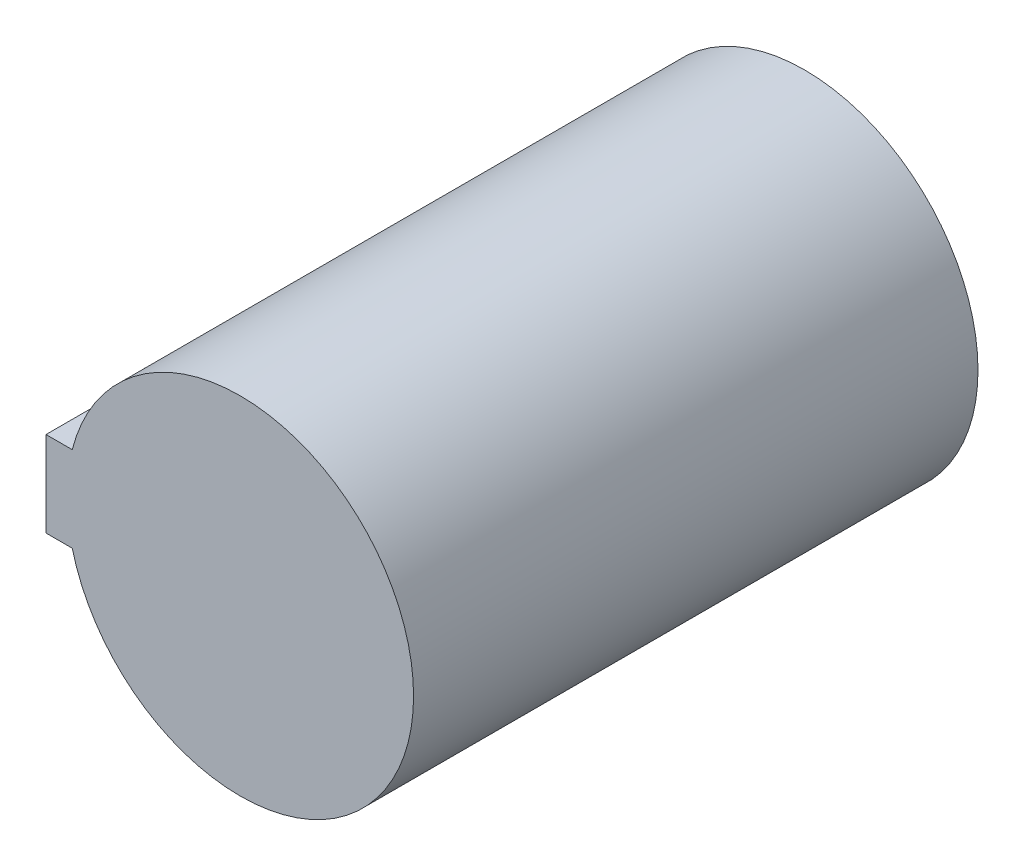
ISO-10303-21;
HEADER;
FILE_DESCRIPTION(('STEP AP214'),'2;1');
FILE_NAME('part.step','',(''),(''),'','','');
FILE_SCHEMA(('AUTOMOTIVE_DESIGN { 1 0 10303 214 1 1 1 1 }'));
ENDSEC;
DATA;
#1=APPLICATION_CONTEXT('core data for automotive mechanical design processes');
#2=APPLICATION_PROTOCOL_DEFINITION('international standard','automotive_design',2000,#1);
#3=PRODUCT_CONTEXT('',#1,'mechanical');
#4=PRODUCT('Part','Part','',(#3));
#5=PRODUCT_RELATED_PRODUCT_CATEGORY('part','',(#4));
#6=PRODUCT_DEFINITION_FORMATION('','',#4);
#7=PRODUCT_DEFINITION_CONTEXT('part definition',#1,'design');
#8=PRODUCT_DEFINITION('design','',#6,#7);
#9=PRODUCT_DEFINITION_SHAPE('','',#8);
#10=(LENGTH_UNIT() NAMED_UNIT(*) SI_UNIT(.MILLI.,.METRE.));
#11=(NAMED_UNIT(*) PLANE_ANGLE_UNIT() SI_UNIT($,.RADIAN.));
#12=(NAMED_UNIT(*) SI_UNIT($,.STERADIAN.) SOLID_ANGLE_UNIT());
#13=UNCERTAINTY_MEASURE_WITH_UNIT(LENGTH_MEASURE(1.E-05),#10,'distance_accuracy_value','');
#14=(GEOMETRIC_REPRESENTATION_CONTEXT(3) GLOBAL_UNCERTAINTY_ASSIGNED_CONTEXT((#13)) GLOBAL_UNIT_ASSIGNED_CONTEXT((#10,
#11,#12)) REPRESENTATION_CONTEXT('',''));
#15=CARTESIAN_POINT('',(0.,0.,0.));
#16=DIRECTION('',(0.,0.,1.));
#17=DIRECTION('',(1.,0.,0.));
#18=AXIS2_PLACEMENT_3D('',#15,#16,#17);
#19=CARTESIAN_POINT('',(0.,0.,25.));
#20=DIRECTION('',(0.,0.,-1.));
#21=DIRECTION('',(-1.,0.,0.));
#22=AXIS2_PLACEMENT_3D('',#19,#20,#21);
#23=CYLINDRICAL_SURFACE('',#22,19.9);
#24=DIRECTION('',(0.,0.,-1.));
#25=VECTOR('',#24,1.);
#26=CARTESIAN_POINT('',(-19.2873015219859,-4.9,25.));
#27=LINE('',#26,#25);
#28=CARTESIAN_POINT('',(-19.2873015219859,-4.9,25.));
#29=VERTEX_POINT('',#28);
#30=CARTESIAN_POINT('',(-19.2873015219859,-4.9,0.));
#31=VERTEX_POINT('',#30);
#32=EDGE_CURVE('E107',#29,#31,#27,.T.);
#33=ORIENTED_EDGE('',*,*,#32,.T.);
#34=CARTESIAN_POINT('',(0.,0.,0.));
#35=DIRECTION('',(0.,0.,-1.));
#36=DIRECTION('',(-1.,0.,0.));
#37=AXIS2_PLACEMENT_3D('',#34,#35,#36);
#38=CIRCLE('',#37,19.9);
#39=CARTESIAN_POINT('',(-19.2873015219859,4.9,0.));
#40=VERTEX_POINT('',#39);
#41=EDGE_CURVE('E11',#31,#40,#38,.T.);
#42=ORIENTED_EDGE('',*,*,#41,.T.);
#43=DIRECTION('',(0.,0.,-1.));
#44=VECTOR('',#43,1.);
#45=CARTESIAN_POINT('',(-19.2873015219859,4.9,25.));
#46=LINE('',#45,#44);
#47=CARTESIAN_POINT('',(-19.2873015219859,4.9,25.));
#48=VERTEX_POINT('',#47);
#49=EDGE_CURVE('E48',#48,#40,#46,.T.);
#50=ORIENTED_EDGE('',*,*,#49,.F.);
#51=CARTESIAN_POINT('',(0.,0.,25.));
#52=DIRECTION('',(0.,0.,1.));
#53=DIRECTION('',(1.,0.,0.));
#54=AXIS2_PLACEMENT_3D('',#51,#52,#53);
#55=CIRCLE('',#54,19.9);
#56=EDGE_CURVE('E108',#29,#48,#55,.T.);
#57=ORIENTED_EDGE('',*,*,#56,.F.);
#58=EDGE_LOOP('',(#33,#42,#50,#57));
#59=FACE_BOUND('',#58,.T.);
#60=CARTESIAN_POINT('',(0.,0.,-39.8));
#61=DIRECTION('',(0.,0.,-1.));
#62=DIRECTION('',(-1.,0.,0.));
#63=AXIS2_PLACEMENT_3D('',#60,#61,#62);
#64=CIRCLE('',#63,19.9);
#65=CARTESIAN_POINT('',(-19.9,0.,-39.8));
#66=VERTEX_POINT('',#65);
#67=EDGE_CURVE('E103',#66,#66,#64,.T.);
#68=ORIENTED_EDGE('',*,*,#67,.F.);
#69=EDGE_LOOP('',(#68));
#70=FACE_BOUND('',#69,.T.);
#71=ADVANCED_FACE('F45',(#59,#70),#23,.T.);
#72=CARTESIAN_POINT('',(-22.3,4.9,25.));
#73=DIRECTION('',(0.,-1.,0.));
#74=DIRECTION('',(1.,0.,0.));
#75=AXIS2_PLACEMENT_3D('',#72,#73,#74);
#76=PLANE('',#75);
#77=DIRECTION('',(-1.,0.,0.));
#78=VECTOR('',#77,1.);
#79=CARTESIAN_POINT('',(-22.3,4.9,0.));
#80=LINE('',#79,#78);
#81=CARTESIAN_POINT('',(-22.3,4.9,0.));
#82=VERTEX_POINT('',#81);
#83=EDGE_CURVE('E96',#40,#82,#80,.T.);
#84=ORIENTED_EDGE('',*,*,#83,.T.);
#85=DIRECTION('',(0.,0.,-1.));
#86=VECTOR('',#85,1.);
#87=CARTESIAN_POINT('',(-22.3,4.9,25.));
#88=LINE('',#87,#86);
#89=CARTESIAN_POINT('',(-22.3,4.9,25.));
#90=VERTEX_POINT('',#89);
#91=EDGE_CURVE('E100',#90,#82,#88,.T.);
#92=ORIENTED_EDGE('',*,*,#91,.F.);
#93=DIRECTION('',(-1.,0.,0.));
#94=VECTOR('',#93,1.);
#95=CARTESIAN_POINT('',(-22.3,4.9,25.));
#96=LINE('',#95,#94);
#97=EDGE_CURVE('E92',#48,#90,#96,.T.);
#98=ORIENTED_EDGE('',*,*,#97,.F.);
#99=ORIENTED_EDGE('',*,*,#49,.T.);
#100=EDGE_LOOP('',(#84,#92,#98,#99));
#101=FACE_BOUND('',#100,.T.);
#102=ADVANCED_FACE('F95',(#101),#76,.F.);
#103=CARTESIAN_POINT('',(-22.3,-4.90000000000001,25.));
#104=DIRECTION('',(1.,0.,0.));
#105=DIRECTION('',(0.,0.,-1.));
#106=AXIS2_PLACEMENT_3D('',#103,#104,#105);
#107=PLANE('',#106);
#108=DIRECTION('',(0.,-1.,0.));
#109=VECTOR('',#108,1.);
#110=CARTESIAN_POINT('',(-22.3,-4.90000000000001,0.));
#111=LINE('',#110,#109);
#112=CARTESIAN_POINT('',(-22.3,-4.90000000000001,0.));
#113=VERTEX_POINT('',#112);
#114=EDGE_CURVE('E78',#82,#113,#111,.T.);
#115=ORIENTED_EDGE('',*,*,#114,.T.);
#116=DIRECTION('',(0.,0.,-1.));
#117=VECTOR('',#116,1.);
#118=CARTESIAN_POINT('',(-22.3,-4.90000000000001,25.));
#119=LINE('',#118,#117);
#120=CARTESIAN_POINT('',(-22.3,-4.90000000000001,25.));
#121=VERTEX_POINT('',#120);
#122=EDGE_CURVE('E111',#121,#113,#119,.T.);
#123=ORIENTED_EDGE('',*,*,#122,.F.);
#124=DIRECTION('',(0.,-1.,0.));
#125=VECTOR('',#124,1.);
#126=CARTESIAN_POINT('',(-22.3,-4.90000000000001,25.));
#127=LINE('',#126,#125);
#128=EDGE_CURVE('E116',#90,#121,#127,.T.);
#129=ORIENTED_EDGE('',*,*,#128,.F.);
#130=ORIENTED_EDGE('',*,*,#91,.T.);
#131=EDGE_LOOP('',(#115,#123,#129,#130));
#132=FACE_BOUND('',#131,.T.);
#133=ADVANCED_FACE('F123',(#132),#107,.F.);
#134=CARTESIAN_POINT('',(-22.3,-4.90000000000001,25.));
#135=DIRECTION('',(0.,1.,0.));
#136=DIRECTION('',(-1.,0.,0.));
#137=AXIS2_PLACEMENT_3D('',#134,#135,#136);
#138=PLANE('',#137);
#139=DIRECTION('',(1.,0.,0.));
#140=VECTOR('',#139,1.);
#141=CARTESIAN_POINT('',(-22.3,-4.90000000000001,0.));
#142=LINE('',#141,#140);
#143=EDGE_CURVE('E119',#113,#31,#142,.T.);
#144=ORIENTED_EDGE('',*,*,#143,.T.);
#145=ORIENTED_EDGE('',*,*,#32,.F.);
#146=DIRECTION('',(1.,0.,0.));
#147=VECTOR('',#146,1.);
#148=CARTESIAN_POINT('',(-22.3,-4.90000000000001,25.));
#149=LINE('',#148,#147);
#150=EDGE_CURVE('E63',#121,#29,#149,.T.);
#151=ORIENTED_EDGE('',*,*,#150,.F.);
#152=ORIENTED_EDGE('',*,*,#122,.T.);
#153=EDGE_LOOP('',(#144,#145,#151,#152));
#154=FACE_BOUND('',#153,.T.);
#155=ADVANCED_FACE('F147',(#154),#138,.F.);
#156=CARTESIAN_POINT('',(0.,0.,25.));
#157=DIRECTION('',(0.,0.,1.));
#158=DIRECTION('',(1.,0.,0.));
#159=AXIS2_PLACEMENT_3D('',#156,#157,#158);
#160=PLANE('',#159);
#161=ORIENTED_EDGE('',*,*,#56,.T.);
#162=ORIENTED_EDGE('',*,*,#97,.T.);
#163=ORIENTED_EDGE('',*,*,#128,.T.);
#164=ORIENTED_EDGE('',*,*,#150,.T.);
#165=EDGE_LOOP('',(#161,#162,#163,#164));
#166=FACE_BOUND('',#165,.T.);
#167=ADVANCED_FACE('F151',(#166),#160,.T.);
#168=CARTESIAN_POINT('',(0.,0.,0.));
#169=DIRECTION('',(0.,0.,1.));
#170=DIRECTION('',(1.,0.,0.));
#171=AXIS2_PLACEMENT_3D('',#168,#169,#170);
#172=PLANE('',#171);
#173=ORIENTED_EDGE('',*,*,#41,.F.);
#174=ORIENTED_EDGE('',*,*,#143,.F.);
#175=ORIENTED_EDGE('',*,*,#114,.F.);
#176=ORIENTED_EDGE('',*,*,#83,.F.);
#177=EDGE_LOOP('',(#173,#174,#175,#176));
#178=FACE_BOUND('',#177,.T.);
#179=ADVANCED_FACE('F101',(#178),#172,.F.);
#180=CARTESIAN_POINT('',(0.,0.,-39.8));
#181=DIRECTION('',(0.,0.,-1.));
#182=DIRECTION('',(-1.,0.,0.));
#183=AXIS2_PLACEMENT_3D('',#180,#181,#182);
#184=PLANE('',#183);
#185=ORIENTED_EDGE('',*,*,#67,.T.);
#186=EDGE_LOOP('',(#185));
#187=FACE_BOUND('',#186,.T.);
#188=ADVANCED_FACE('F137',(#187),#184,.T.);
#189=CLOSED_SHELL('',(#71,#102,#133,#155,#167,#179,#188));
#190=MANIFOLD_SOLID_BREP('B2',#189);
#191=ADVANCED_BREP_SHAPE_REPRESENTATION('',(#18,#190),#14);
#192=SHAPE_DEFINITION_REPRESENTATION(#9,#191);
ENDSEC;
END-ISO-10303-21;
